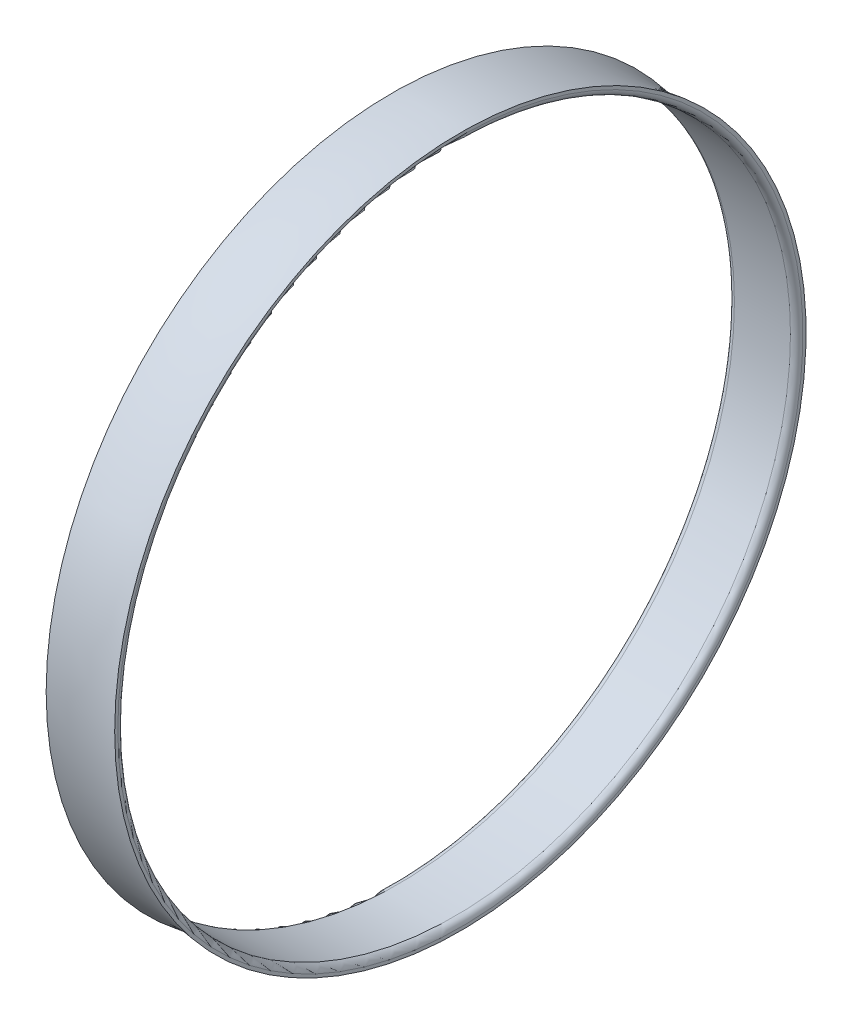
ISO-10303-21;
HEADER;
FILE_DESCRIPTION(('STEP AP214'),'2;1');
FILE_NAME('part.step','',(''),(''),'','','');
FILE_SCHEMA(('AUTOMOTIVE_DESIGN { 1 0 10303 214 1 1 1 1 }'));
ENDSEC;
DATA;
#1=APPLICATION_CONTEXT('core data for automotive mechanical design processes');
#2=APPLICATION_PROTOCOL_DEFINITION('international standard','automotive_design',2000,#1);
#3=PRODUCT_CONTEXT('',#1,'mechanical');
#4=PRODUCT('Part','Part','',(#3));
#5=PRODUCT_RELATED_PRODUCT_CATEGORY('part','',(#4));
#6=PRODUCT_DEFINITION_FORMATION('','',#4);
#7=PRODUCT_DEFINITION_CONTEXT('part definition',#1,'design');
#8=PRODUCT_DEFINITION('design','',#6,#7);
#9=PRODUCT_DEFINITION_SHAPE('','',#8);
#10=(LENGTH_UNIT() NAMED_UNIT(*) SI_UNIT(.MILLI.,.METRE.));
#11=(NAMED_UNIT(*) PLANE_ANGLE_UNIT() SI_UNIT($,.RADIAN.));
#12=(NAMED_UNIT(*) SI_UNIT($,.STERADIAN.) SOLID_ANGLE_UNIT());
#13=UNCERTAINTY_MEASURE_WITH_UNIT(LENGTH_MEASURE(1.E-05),#10,'distance_accuracy_value','');
#14=(GEOMETRIC_REPRESENTATION_CONTEXT(3) GLOBAL_UNCERTAINTY_ASSIGNED_CONTEXT((#13)) GLOBAL_UNIT_ASSIGNED_CONTEXT((#10,
#11,#12)) REPRESENTATION_CONTEXT('',''));
#15=CARTESIAN_POINT('',(0.,0.,0.));
#16=DIRECTION('',(0.,0.,1.));
#17=DIRECTION('',(1.,0.,0.));
#18=AXIS2_PLACEMENT_3D('',#15,#16,#17);
#19=CARTESIAN_POINT('',(10.2855703619102,0.,0.));
#20=DIRECTION('',(-1.,0.,0.));
#21=DIRECTION('',(0.,0.,1.));
#22=AXIS2_PLACEMENT_3D('',#19,#20,#21);
#23=TOROIDAL_SURFACE('',#22,84.9915242061173,30.);
#24=CARTESIAN_POINT('',(4.78557036191016,0.,0.));
#25=DIRECTION('',(-1.,0.,0.));
#26=DIRECTION('',(0.,0.,1.));
#27=AXIS2_PLACEMENT_3D('',#24,#25,#26);
#28=CIRCLE('',#27,55.5);
#29=CARTESIAN_POINT('',(4.78557036191016,0.,55.5));
#30=VERTEX_POINT('',#29);
#31=EDGE_CURVE('E53',#30,#30,#28,.T.);
#32=ORIENTED_EDGE('',*,*,#31,.F.);
#33=EDGE_LOOP('',(#32));
#34=FACE_BOUND('',#33,.T.);
#35=CARTESIAN_POINT('',(15.7855703619101,0.,0.));
#36=DIRECTION('',(-1.,0.,0.));
#37=DIRECTION('',(0.,0.,1.));
#38=AXIS2_PLACEMENT_3D('',#35,#36,#37);
#39=CIRCLE('',#38,55.5);
#40=CARTESIAN_POINT('',(15.7855703619101,0.,55.5));
#41=VERTEX_POINT('',#40);
#42=EDGE_CURVE('E10',#41,#41,#39,.T.);
#43=ORIENTED_EDGE('',*,*,#42,.T.);
#44=EDGE_LOOP('',(#43));
#45=FACE_BOUND('',#44,.T.);
#46=ADVANCED_FACE('F31',(#34,#45),#23,.F.);
#47=CARTESIAN_POINT('',(15.7855703619102,55.5,0.));
#48=DIRECTION('',(-1.,0.,0.));
#49=DIRECTION('',(0.,0.,1.));
#50=AXIS2_PLACEMENT_3D('',#47,#48,#49);
#51=PLANE('',#50);
#52=ORIENTED_EDGE('',*,*,#42,.F.);
#53=EDGE_LOOP('',(#52));
#54=FACE_BOUND('',#53,.T.);
#55=CARTESIAN_POINT('',(15.7855703619102,0.,0.));
#56=DIRECTION('',(-1.,0.,0.));
#57=DIRECTION('',(0.,0.,1.));
#58=AXIS2_PLACEMENT_3D('',#55,#56,#57);
#59=CIRCLE('',#58,54.9972255364846);
#60=CARTESIAN_POINT('',(15.7855703619102,0.,54.9972255364846));
#61=VERTEX_POINT('',#60);
#62=EDGE_CURVE('E37',#61,#61,#59,.T.);
#63=ORIENTED_EDGE('',*,*,#62,.T.);
#64=EDGE_LOOP('',(#63));
#65=FACE_BOUND('',#64,.T.);
#66=ADVANCED_FACE('F60',(#54,#65),#51,.F.);
#67=CARTESIAN_POINT('',(14.7855703619102,0.,0.));
#68=DIRECTION('',(-1.,0.,0.));
#69=DIRECTION('',(0.,0.,1.));
#70=AXIS2_PLACEMENT_3D('',#67,#68,#69);
#71=TOROIDAL_SURFACE('',#70,54.9972255364846,1.);
#72=ORIENTED_EDGE('',*,*,#62,.F.);
#73=EDGE_LOOP('',(#72));
#74=FACE_BOUND('',#73,.T.);
#75=CARTESIAN_POINT('',(14.7855703619102,0.,0.));
#76=DIRECTION('',(-1.,0.,0.));
#77=DIRECTION('',(0.,0.,1.));
#78=AXIS2_PLACEMENT_3D('',#75,#76,#77);
#79=CIRCLE('',#78,53.9972255364846);
#80=CARTESIAN_POINT('',(14.7855703619102,0.,53.9972255364846));
#81=VERTEX_POINT('',#80);
#82=EDGE_CURVE('E41',#81,#81,#79,.T.);
#83=ORIENTED_EDGE('',*,*,#82,.T.);
#84=EDGE_LOOP('',(#83));
#85=FACE_BOUND('',#84,.T.);
#86=ADVANCED_FACE('F64',(#74,#85),#71,.T.);
#87=CARTESIAN_POINT('',(-59.6339304289586,0.,0.));
#88=DIRECTION('',(-1.,0.,0.));
#89=DIRECTION('',(0.,0.,1.));
#90=AXIS2_PLACEMENT_3D('',#87,#88,#89);
#91=CYLINDRICAL_SURFACE('',#90,53.9972255364846);
#92=ORIENTED_EDGE('',*,*,#82,.F.);
#93=EDGE_LOOP('',(#92));
#94=FACE_BOUND('',#93,.T.);
#95=CARTESIAN_POINT('',(5.78557036191016,0.,0.));
#96=DIRECTION('',(-1.,0.,0.));
#97=DIRECTION('',(0.,0.,1.));
#98=AXIS2_PLACEMENT_3D('',#95,#96,#97);
#99=CIRCLE('',#98,53.9972255364846);
#100=CARTESIAN_POINT('',(5.78557036191016,0.,53.9972255364846));
#101=VERTEX_POINT('',#100);
#102=EDGE_CURVE('E45',#101,#101,#99,.T.);
#103=ORIENTED_EDGE('',*,*,#102,.T.);
#104=EDGE_LOOP('',(#103));
#105=FACE_BOUND('',#104,.T.);
#106=ADVANCED_FACE('F69',(#94,#105),#91,.F.);
#107=CARTESIAN_POINT('',(5.78557036191015,0.,0.));
#108=DIRECTION('',(-1.,0.,0.));
#109=DIRECTION('',(0.,0.,1.));
#110=AXIS2_PLACEMENT_3D('',#107,#108,#109);
#111=TOROIDAL_SURFACE('',#110,54.9972255364846,1.00000000000001);
#112=ORIENTED_EDGE('',*,*,#102,.F.);
#113=EDGE_LOOP('',(#112));
#114=FACE_BOUND('',#113,.T.);
#115=CARTESIAN_POINT('',(4.78557036191014,0.,0.));
#116=DIRECTION('',(-1.,0.,0.));
#117=DIRECTION('',(0.,0.,1.));
#118=AXIS2_PLACEMENT_3D('',#115,#116,#117);
#119=CIRCLE('',#118,54.9972255364846);
#120=CARTESIAN_POINT('',(4.78557036191014,0.,54.9972255364846));
#121=VERTEX_POINT('',#120);
#122=EDGE_CURVE('E50',#121,#121,#119,.T.);
#123=ORIENTED_EDGE('',*,*,#122,.T.);
#124=EDGE_LOOP('',(#123));
#125=FACE_BOUND('',#124,.T.);
#126=ADVANCED_FACE('F75',(#114,#125),#111,.T.);
#127=CARTESIAN_POINT('',(4.78557036191015,55.5,0.));
#128=DIRECTION('',(1.,0.,0.));
#129=DIRECTION('',(0.,0.,-1.));
#130=AXIS2_PLACEMENT_3D('',#127,#128,#129);
#131=PLANE('',#130);
#132=ORIENTED_EDGE('',*,*,#122,.F.);
#133=EDGE_LOOP('',(#132));
#134=FACE_BOUND('',#133,.T.);
#135=ORIENTED_EDGE('',*,*,#31,.T.);
#136=EDGE_LOOP('',(#135));
#137=FACE_BOUND('',#136,.T.);
#138=ADVANCED_FACE('F57',(#134,#137),#131,.F.);
#139=CLOSED_SHELL('',(#46,#66,#86,#106,#126,#138));
#140=MANIFOLD_SOLID_BREP('B2',#139);
#141=ADVANCED_BREP_SHAPE_REPRESENTATION('',(#18,#140),#14);
#142=SHAPE_DEFINITION_REPRESENTATION(#9,#141);
ENDSEC;
END-ISO-10303-21;
